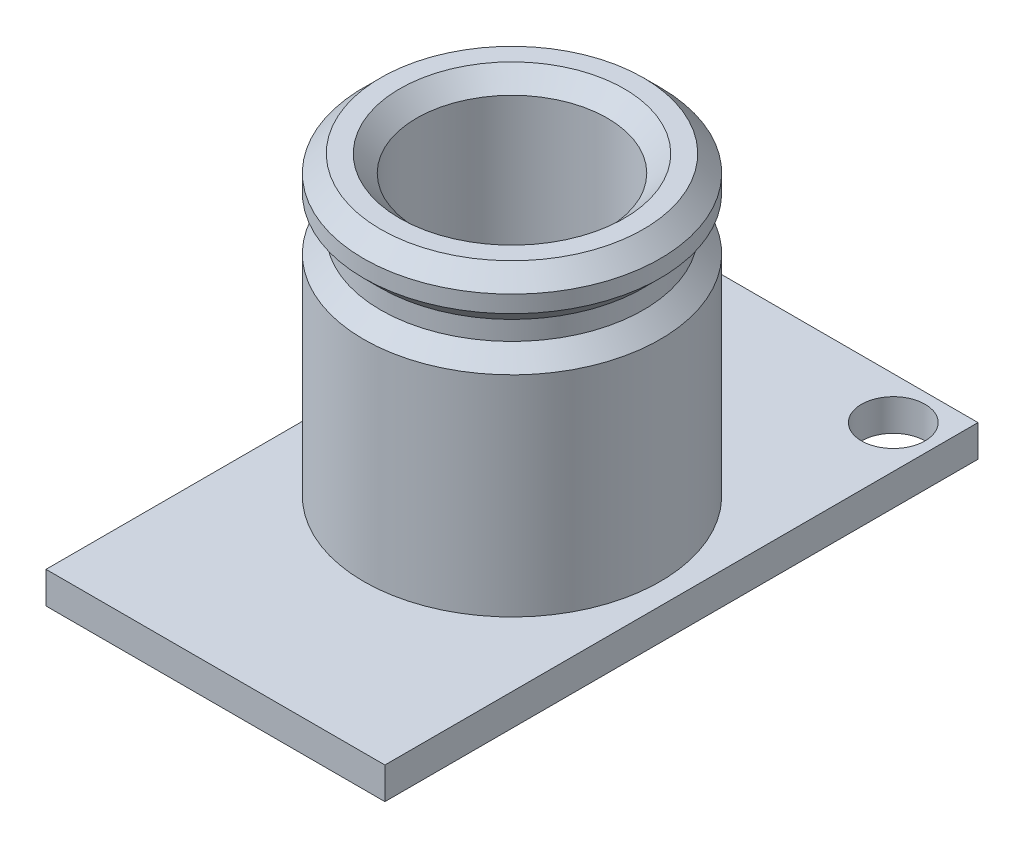
ISO-10303-21;
HEADER;
FILE_DESCRIPTION(('STEP AP214'),'2;1');
FILE_NAME('part.step','',(''),(''),'','','');
FILE_SCHEMA(('AUTOMOTIVE_DESIGN { 1 0 10303 214 1 1 1 1 }'));
ENDSEC;
DATA;
#1=APPLICATION_CONTEXT('core data for automotive mechanical design processes');
#2=APPLICATION_PROTOCOL_DEFINITION('international standard','automotive_design',2000,#1);
#3=PRODUCT_CONTEXT('',#1,'mechanical');
#4=PRODUCT('Part','Part','',(#3));
#5=PRODUCT_RELATED_PRODUCT_CATEGORY('part','',(#4));
#6=PRODUCT_DEFINITION_FORMATION('','',#4);
#7=PRODUCT_DEFINITION_CONTEXT('part definition',#1,'design');
#8=PRODUCT_DEFINITION('design','',#6,#7);
#9=PRODUCT_DEFINITION_SHAPE('','',#8);
#10=(LENGTH_UNIT() NAMED_UNIT(*) SI_UNIT(.MILLI.,.METRE.));
#11=(NAMED_UNIT(*) PLANE_ANGLE_UNIT() SI_UNIT($,.RADIAN.));
#12=(NAMED_UNIT(*) SI_UNIT($,.STERADIAN.) SOLID_ANGLE_UNIT());
#13=UNCERTAINTY_MEASURE_WITH_UNIT(LENGTH_MEASURE(1.E-05),#10,'distance_accuracy_value','');
#14=(GEOMETRIC_REPRESENTATION_CONTEXT(3) GLOBAL_UNCERTAINTY_ASSIGNED_CONTEXT((#13)) GLOBAL_UNIT_ASSIGNED_CONTEXT((#10,
#11,#12)) REPRESENTATION_CONTEXT('',''));
#15=CARTESIAN_POINT('',(0.,0.,0.));
#16=DIRECTION('',(0.,0.,1.));
#17=DIRECTION('',(1.,0.,0.));
#18=AXIS2_PLACEMENT_3D('',#15,#16,#17);
#19=CARTESIAN_POINT('',(0.,15.5,0.));
#20=DIRECTION('',(0.,-1.,0.));
#21=DIRECTION('',(0.,0.,-1.));
#22=AXIS2_PLACEMENT_3D('',#19,#20,#21);
#23=CYLINDRICAL_SURFACE('',#22,7.);
#24=CARTESIAN_POINT('',(0.,13.9,0.));
#25=DIRECTION('',(0.,-1.,0.));
#26=DIRECTION('',(0.,0.,-1.));
#27=AXIS2_PLACEMENT_3D('',#24,#25,#26);
#28=CIRCLE('',#27,7.00000000000005);
#29=CARTESIAN_POINT('',(0.,13.9,-7.));
#30=VERTEX_POINT('',#29);
#31=EDGE_CURVE('E75',#30,#30,#28,.T.);
#32=ORIENTED_EDGE('',*,*,#31,.F.);
#33=EDGE_LOOP('',(#32));
#34=FACE_BOUND('',#33,.T.);
#35=CARTESIAN_POINT('',(0.,14.7,0.));
#36=DIRECTION('',(0.,1.,0.));
#37=DIRECTION('',(0.,0.,1.));
#38=AXIS2_PLACEMENT_3D('',#35,#36,#37);
#39=CIRCLE('',#38,7.);
#40=CARTESIAN_POINT('',(0.,14.7,7.));
#41=VERTEX_POINT('',#40);
#42=EDGE_CURVE('E63',#41,#41,#39,.F.);
#43=ORIENTED_EDGE('',*,*,#42,.T.);
#44=EDGE_LOOP('',(#43));
#45=FACE_BOUND('',#44,.T.);
#46=ADVANCED_FACE('F51',(#34,#45),#23,.T.);
#47=CARTESIAN_POINT('',(0.,15.5,0.));
#48=DIRECTION('',(0.,1.,0.));
#49=DIRECTION('',(0.,0.,1.));
#50=AXIS2_PLACEMENT_3D('',#47,#48,#49);
#51=PLANE('',#50);
#52=CARTESIAN_POINT('',(0.,15.5,0.));
#53=DIRECTION('',(0.,1.,0.));
#54=DIRECTION('',(0.,0.,1.));
#55=AXIS2_PLACEMENT_3D('',#52,#53,#54);
#56=CIRCLE('',#55,5.3);
#57=CARTESIAN_POINT('',(0.,15.5,5.3));
#58=VERTEX_POINT('',#57);
#59=EDGE_CURVE('E11',#58,#58,#56,.F.);
#60=ORIENTED_EDGE('',*,*,#59,.T.);
#61=EDGE_LOOP('',(#60));
#62=FACE_BOUND('',#61,.T.);
#63=CARTESIAN_POINT('',(0.,15.5,0.));
#64=DIRECTION('',(0.,1.,0.));
#65=DIRECTION('',(0.,0.,1.));
#66=AXIS2_PLACEMENT_3D('',#63,#64,#65);
#67=CIRCLE('',#66,6.19999999999999);
#68=CARTESIAN_POINT('',(0.,15.5,6.19999999999999));
#69=VERTEX_POINT('',#68);
#70=EDGE_CURVE('E67',#69,#69,#67,.T.);
#71=ORIENTED_EDGE('',*,*,#70,.T.);
#72=EDGE_LOOP('',(#71));
#73=FACE_BOUND('',#72,.T.);
#74=ADVANCED_FACE('F109',(#62,#73),#51,.T.);
#75=CARTESIAN_POINT('',(0.,15.5,0.));
#76=DIRECTION('',(0.,-1.,0.));
#77=DIRECTION('',(0.,0.,-1.));
#78=AXIS2_PLACEMENT_3D('',#75,#76,#77);
#79=CONICAL_SURFACE('',#78,6.19999999999999,0.785398163397447);
#80=ORIENTED_EDGE('',*,*,#42,.F.);
#81=EDGE_LOOP('',(#80));
#82=FACE_BOUND('',#81,.T.);
#83=ORIENTED_EDGE('',*,*,#70,.F.);
#84=EDGE_LOOP('',(#83));
#85=FACE_BOUND('',#84,.T.);
#86=ADVANCED_FACE('F115',(#82,#85),#79,.T.);
#87=CARTESIAN_POINT('',(0.,13.9,0.));
#88=DIRECTION('',(0.,1.,0.));
#89=DIRECTION('',(0.,0.,1.));
#90=AXIS2_PLACEMENT_3D('',#87,#88,#89);
#91=CONICAL_SURFACE('',#90,7.00000000000005,0.785398163397366);
#92=CARTESIAN_POINT('',(0.,13.0999999999999,0.));
#93=DIRECTION('',(0.,-1.,0.));
#94=DIRECTION('',(0.,0.,-1.));
#95=AXIS2_PLACEMENT_3D('',#92,#93,#94);
#96=CIRCLE('',#95,6.20000000000004);
#97=CARTESIAN_POINT('',(0.,13.0999999999999,-6.2));
#98=VERTEX_POINT('',#97);
#99=EDGE_CURVE('E78',#98,#98,#96,.T.);
#100=ORIENTED_EDGE('',*,*,#99,.F.);
#101=EDGE_LOOP('',(#100));
#102=FACE_BOUND('',#101,.T.);
#103=ORIENTED_EDGE('',*,*,#31,.T.);
#104=EDGE_LOOP('',(#103));
#105=FACE_BOUND('',#104,.T.);
#106=ADVANCED_FACE('F123',(#102,#105),#91,.T.);
#107=CARTESIAN_POINT('',(0.,-1000.,-3.43024899888577E-12));
#108=DIRECTION('',(0.,-1.,0.));
#109=DIRECTION('',(0.,0.,-1.));
#110=AXIS2_PLACEMENT_3D('',#107,#108,#109);
#111=CYLINDRICAL_SURFACE('',#110,6.20000000000004);
#112=CARTESIAN_POINT('',(0.,12.2,0.));
#113=DIRECTION('',(0.,-1.,0.));
#114=DIRECTION('',(0.,0.,-1.));
#115=AXIS2_PLACEMENT_3D('',#112,#113,#114);
#116=CIRCLE('',#115,6.20000000000004);
#117=CARTESIAN_POINT('',(0.,12.2,-6.2));
#118=VERTEX_POINT('',#117);
#119=EDGE_CURVE('E81',#118,#118,#116,.T.);
#120=ORIENTED_EDGE('',*,*,#119,.F.);
#121=EDGE_LOOP('',(#120));
#122=FACE_BOUND('',#121,.T.);
#123=ORIENTED_EDGE('',*,*,#99,.T.);
#124=EDGE_LOOP('',(#123));
#125=FACE_BOUND('',#124,.T.);
#126=ADVANCED_FACE('F128',(#122,#125),#111,.T.);
#127=CARTESIAN_POINT('',(0.,12.2,0.));
#128=DIRECTION('',(0.,-1.,0.));
#129=DIRECTION('',(0.,0.,-1.));
#130=AXIS2_PLACEMENT_3D('',#127,#128,#129);
#131=CONICAL_SURFACE('',#130,6.20000000000004,0.785398163397503);
#132=CARTESIAN_POINT('',(0.,11.4000000000001,0.));
#133=DIRECTION('',(0.,-1.,0.));
#134=DIRECTION('',(0.,0.,-1.));
#135=AXIS2_PLACEMENT_3D('',#132,#133,#134);
#136=CIRCLE('',#135,7.00000000000004);
#137=CARTESIAN_POINT('',(0.,11.4000000000001,-7.));
#138=VERTEX_POINT('',#137);
#139=EDGE_CURVE('E84',#138,#138,#136,.T.);
#140=ORIENTED_EDGE('',*,*,#139,.F.);
#141=EDGE_LOOP('',(#140));
#142=FACE_BOUND('',#141,.T.);
#143=ORIENTED_EDGE('',*,*,#119,.T.);
#144=EDGE_LOOP('',(#143));
#145=FACE_BOUND('',#144,.T.);
#146=ADVANCED_FACE('F138',(#142,#145),#131,.T.);
#147=CARTESIAN_POINT('',(0.,1.5,0.));
#148=DIRECTION('',(0.,1.,0.));
#149=DIRECTION('',(0.,0.,1.));
#150=AXIS2_PLACEMENT_3D('',#147,#148,#149);
#151=PLANE('',#150);
#152=CARTESIAN_POINT('',(0.,1.5,0.));
#153=DIRECTION('',(0.,1.,0.));
#154=DIRECTION('',(0.,0.,1.));
#155=AXIS2_PLACEMENT_3D('',#152,#153,#154);
#156=CIRCLE('',#155,7.);
#157=CARTESIAN_POINT('',(0.,1.5,7.));
#158=VERTEX_POINT('',#157);
#159=EDGE_CURVE('E72',#158,#158,#156,.T.);
#160=ORIENTED_EDGE('',*,*,#159,.F.);
#161=EDGE_LOOP('',(#160));
#162=FACE_BOUND('',#161,.T.);
#163=ADVANCED_FACE('F104',(#162),#151,.F.);
#164=ORIENTED_EDGE('',*,*,#139,.T.);
#165=EDGE_LOOP('',(#164));
#166=FACE_BOUND('',#165,.T.);
#167=ORIENTED_EDGE('',*,*,#159,.T.);
#168=EDGE_LOOP('',(#167));
#169=FACE_BOUND('',#168,.T.);
#170=ADVANCED_FACE('F95',(#166,#169),#23,.T.);
#171=CARTESIAN_POINT('',(0.,7.5,0.));
#172=DIRECTION('',(0.,1.,0.));
#173=DIRECTION('',(0.,0.,1.));
#174=AXIS2_PLACEMENT_3D('',#171,#172,#173);
#175=CYLINDRICAL_SURFACE('',#174,4.5);
#176=CARTESIAN_POINT('',(0.,14.7,0.));
#177=DIRECTION('',(0.,1.,0.));
#178=DIRECTION('',(0.,0.,1.));
#179=AXIS2_PLACEMENT_3D('',#176,#177,#178);
#180=CIRCLE('',#179,4.5);
#181=CARTESIAN_POINT('',(0.,14.7,4.5));
#182=VERTEX_POINT('',#181);
#183=EDGE_CURVE('E59',#182,#182,#180,.T.);
#184=ORIENTED_EDGE('',*,*,#183,.T.);
#185=EDGE_LOOP('',(#184));
#186=FACE_BOUND('',#185,.T.);
#187=CARTESIAN_POINT('',(0.,7.5,0.));
#188=DIRECTION('',(0.,1.,0.));
#189=DIRECTION('',(0.,0.,1.));
#190=AXIS2_PLACEMENT_3D('',#187,#188,#189);
#191=CIRCLE('',#190,4.5);
#192=CARTESIAN_POINT('',(0.,7.5,4.5));
#193=VERTEX_POINT('',#192);
#194=EDGE_CURVE('E87',#193,#193,#191,.T.);
#195=ORIENTED_EDGE('',*,*,#194,.F.);
#196=EDGE_LOOP('',(#195));
#197=FACE_BOUND('',#196,.T.);
#198=ADVANCED_FACE('F93',(#186,#197),#175,.F.);
#199=CARTESIAN_POINT('',(0.,7.5,0.));
#200=DIRECTION('',(0.,1.,0.));
#201=DIRECTION('',(0.,0.,1.));
#202=AXIS2_PLACEMENT_3D('',#199,#200,#201);
#203=PLANE('',#202);
#204=ORIENTED_EDGE('',*,*,#194,.T.);
#205=EDGE_LOOP('',(#204));
#206=FACE_BOUND('',#205,.T.);
#207=ADVANCED_FACE('F91',(#206),#203,.T.);
#208=CARTESIAN_POINT('',(0.,14.7,0.));
#209=DIRECTION('',(0.,1.,0.));
#210=DIRECTION('',(0.,0.,1.));
#211=AXIS2_PLACEMENT_3D('',#208,#209,#210);
#212=CONICAL_SURFACE('',#211,4.5,0.785398163397449);
#213=ORIENTED_EDGE('',*,*,#59,.F.);
#214=EDGE_LOOP('',(#213));
#215=FACE_BOUND('',#214,.T.);
#216=ORIENTED_EDGE('',*,*,#183,.F.);
#217=EDGE_LOOP('',(#216));
#218=FACE_BOUND('',#217,.T.);
#219=ADVANCED_FACE('F54',(#215,#218),#212,.F.);
#220=CLOSED_SHELL('',(#46,#74,#86,#106,#126,#146,#163,#170,#198,#207,#219));
#221=MANIFOLD_SOLID_BREP('B2',#220);
#222=CARTESIAN_POINT('',(8.,1.5,-14.));
#223=DIRECTION('',(-1.,0.,0.));
#224=DIRECTION('',(0.,0.,1.));
#225=AXIS2_PLACEMENT_3D('',#222,#223,#224);
#226=PLANE('',#225);
#227=DIRECTION('',(0.,0.,-1.));
#228=VECTOR('',#227,1.);
#229=CARTESIAN_POINT('',(8.,0.,-14.));
#230=LINE('',#229,#228);
#231=CARTESIAN_POINT('',(8.,0.,14.));
#232=VERTEX_POINT('',#231);
#233=CARTESIAN_POINT('',(8.,0.,-14.));
#234=VERTEX_POINT('',#233);
#235=EDGE_CURVE('E280',#232,#234,#230,.T.);
#236=ORIENTED_EDGE('',*,*,#235,.T.);
#237=DIRECTION('',(0.,-1.,0.));
#238=VECTOR('',#237,1.);
#239=CARTESIAN_POINT('',(8.,1.5,-14.));
#240=LINE('',#239,#238);
#241=CARTESIAN_POINT('',(8.,1.5,-14.));
#242=VERTEX_POINT('',#241);
#243=EDGE_CURVE('E49',#242,#234,#240,.T.);
#244=ORIENTED_EDGE('',*,*,#243,.F.);
#245=DIRECTION('',(0.,0.,-1.));
#246=VECTOR('',#245,1.);
#247=CARTESIAN_POINT('',(8.,1.5,-14.));
#248=LINE('',#247,#246);
#249=CARTESIAN_POINT('',(8.,1.5,14.));
#250=VERTEX_POINT('',#249);
#251=EDGE_CURVE('E268',#250,#242,#248,.T.);
#252=ORIENTED_EDGE('',*,*,#251,.F.);
#253=DIRECTION('',(0.,-1.,0.));
#254=VECTOR('',#253,1.);
#255=CARTESIAN_POINT('',(8.,1.5,14.));
#256=LINE('',#255,#254);
#257=EDGE_CURVE('E276',#250,#232,#256,.T.);
#258=ORIENTED_EDGE('',*,*,#257,.T.);
#259=EDGE_LOOP('',(#236,#244,#252,#258));
#260=FACE_BOUND('',#259,.T.);
#261=ADVANCED_FACE('F217',(#260),#226,.F.);
#262=CARTESIAN_POINT('',(-8.,1.5,-14.));
#263=DIRECTION('',(0.,0.,1.));
#264=DIRECTION('',(1.,0.,0.));
#265=AXIS2_PLACEMENT_3D('',#262,#263,#264);
#266=PLANE('',#265);
#267=DIRECTION('',(-1.,0.,0.));
#268=VECTOR('',#267,1.);
#269=CARTESIAN_POINT('',(-8.,0.,-14.));
#270=LINE('',#269,#268);
#271=CARTESIAN_POINT('',(-8.,0.,-14.));
#272=VERTEX_POINT('',#271);
#273=EDGE_CURVE('E272',#234,#272,#270,.T.);
#274=ORIENTED_EDGE('',*,*,#273,.T.);
#275=DIRECTION('',(0.,-1.,0.));
#276=VECTOR('',#275,1.);
#277=CARTESIAN_POINT('',(-8.,1.5,-14.));
#278=LINE('',#277,#276);
#279=CARTESIAN_POINT('',(-8.,1.5,-14.));
#280=VERTEX_POINT('',#279);
#281=EDGE_CURVE('E225',#280,#272,#278,.T.);
#282=ORIENTED_EDGE('',*,*,#281,.F.);
#283=DIRECTION('',(-1.,0.,0.));
#284=VECTOR('',#283,1.);
#285=CARTESIAN_POINT('',(-8.,1.5,-14.));
#286=LINE('',#285,#284);
#287=EDGE_CURVE('E263',#242,#280,#286,.T.);
#288=ORIENTED_EDGE('',*,*,#287,.F.);
#289=ORIENTED_EDGE('',*,*,#243,.T.);
#290=EDGE_LOOP('',(#274,#282,#288,#289));
#291=FACE_BOUND('',#290,.T.);
#292=ADVANCED_FACE('F271',(#291),#266,.F.);
#293=CARTESIAN_POINT('',(-8.,1.5,-14.));
#294=DIRECTION('',(1.,0.,0.));
#295=DIRECTION('',(0.,0.,-1.));
#296=AXIS2_PLACEMENT_3D('',#293,#294,#295);
#297=PLANE('',#296);
#298=DIRECTION('',(0.,0.,1.));
#299=VECTOR('',#298,1.);
#300=CARTESIAN_POINT('',(-8.,0.,-14.));
#301=LINE('',#300,#299);
#302=CARTESIAN_POINT('',(-8.,0.,14.));
#303=VERTEX_POINT('',#302);
#304=EDGE_CURVE('E250',#272,#303,#301,.T.);
#305=ORIENTED_EDGE('',*,*,#304,.T.);
#306=DIRECTION('',(0.,-1.,0.));
#307=VECTOR('',#306,1.);
#308=CARTESIAN_POINT('',(-8.,1.5,14.));
#309=LINE('',#308,#307);
#310=CARTESIAN_POINT('',(-8.,1.5,14.));
#311=VERTEX_POINT('',#310);
#312=EDGE_CURVE('E273',#311,#303,#309,.T.);
#313=ORIENTED_EDGE('',*,*,#312,.F.);
#314=DIRECTION('',(0.,0.,1.));
#315=VECTOR('',#314,1.);
#316=CARTESIAN_POINT('',(-8.,1.5,-14.));
#317=LINE('',#316,#315);
#318=EDGE_CURVE('E266',#280,#311,#317,.T.);
#319=ORIENTED_EDGE('',*,*,#318,.F.);
#320=ORIENTED_EDGE('',*,*,#281,.T.);
#321=EDGE_LOOP('',(#305,#313,#319,#320));
#322=FACE_BOUND('',#321,.T.);
#323=ADVANCED_FACE('F274',(#322),#297,.F.);
#324=CARTESIAN_POINT('',(-8.,1.5,14.));
#325=DIRECTION('',(0.,0.,-1.));
#326=DIRECTION('',(-1.,0.,0.));
#327=AXIS2_PLACEMENT_3D('',#324,#325,#326);
#328=PLANE('',#327);
#329=DIRECTION('',(1.,0.,0.));
#330=VECTOR('',#329,1.);
#331=CARTESIAN_POINT('',(-8.,0.,14.));
#332=LINE('',#331,#330);
#333=EDGE_CURVE('E256',#303,#232,#332,.T.);
#334=ORIENTED_EDGE('',*,*,#333,.T.);
#335=ORIENTED_EDGE('',*,*,#257,.F.);
#336=DIRECTION('',(1.,0.,0.));
#337=VECTOR('',#336,1.);
#338=CARTESIAN_POINT('',(-8.,1.5,14.));
#339=LINE('',#338,#337);
#340=EDGE_CURVE('E233',#311,#250,#339,.T.);
#341=ORIENTED_EDGE('',*,*,#340,.F.);
#342=ORIENTED_EDGE('',*,*,#312,.T.);
#343=EDGE_LOOP('',(#334,#335,#341,#342));
#344=FACE_BOUND('',#343,.T.);
#345=ADVANCED_FACE('F288',(#344),#328,.F.);
#346=CARTESIAN_POINT('',(0.,1.5,0.));
#347=DIRECTION('',(0.,1.,0.));
#348=DIRECTION('',(0.,0.,1.));
#349=AXIS2_PLACEMENT_3D('',#346,#347,#348);
#350=PLANE('',#349);
#351=CARTESIAN_POINT('',(6.,1.5,-12.));
#352=DIRECTION('',(0.,-1.,0.));
#353=DIRECTION('',(0.,0.,1.));
#354=AXIS2_PLACEMENT_3D('',#351,#352,#353);
#355=CIRCLE('',#354,1.5);
#356=CARTESIAN_POINT('',(6.,1.5,-10.5));
#357=VERTEX_POINT('',#356);
#358=EDGE_CURVE('E300',#357,#357,#355,.T.);
#359=ORIENTED_EDGE('',*,*,#358,.T.);
#360=EDGE_LOOP('',(#359));
#361=FACE_BOUND('',#360,.T.);
#362=CARTESIAN_POINT('',(-6.,1.5,-12.));
#363=DIRECTION('',(0.,1.,0.));
#364=DIRECTION('',(0.,0.,1.));
#365=AXIS2_PLACEMENT_3D('',#362,#363,#364);
#366=CIRCLE('',#365,1.5);
#367=CARTESIAN_POINT('',(-6.,1.5,-10.5));
#368=VERTEX_POINT('',#367);
#369=EDGE_CURVE('E294',#368,#368,#366,.T.);
#370=ORIENTED_EDGE('',*,*,#369,.F.);
#371=EDGE_LOOP('',(#370));
#372=FACE_BOUND('',#371,.T.);
#373=ORIENTED_EDGE('',*,*,#251,.T.);
#374=ORIENTED_EDGE('',*,*,#287,.T.);
#375=ORIENTED_EDGE('',*,*,#318,.T.);
#376=ORIENTED_EDGE('',*,*,#340,.T.);
#377=EDGE_LOOP('',(#373,#374,#375,#376));
#378=FACE_BOUND('',#377,.T.);
#379=ADVANCED_FACE('F264',(#361,#372,#378),#350,.T.);
#380=CARTESIAN_POINT('',(0.,0.,0.));
#381=DIRECTION('',(0.,1.,0.));
#382=DIRECTION('',(0.,0.,1.));
#383=AXIS2_PLACEMENT_3D('',#380,#381,#382);
#384=PLANE('',#383);
#385=CARTESIAN_POINT('',(6.,0.,-12.));
#386=DIRECTION('',(0.,-1.,0.));
#387=DIRECTION('',(0.,0.,1.));
#388=AXIS2_PLACEMENT_3D('',#385,#386,#387);
#389=CIRCLE('',#388,1.5);
#390=CARTESIAN_POINT('',(6.,0.,-10.5));
#391=VERTEX_POINT('',#390);
#392=EDGE_CURVE('E297',#391,#391,#389,.T.);
#393=ORIENTED_EDGE('',*,*,#392,.F.);
#394=EDGE_LOOP('',(#393));
#395=FACE_BOUND('',#394,.T.);
#396=CARTESIAN_POINT('',(-6.,0.,-12.));
#397=DIRECTION('',(0.,1.,0.));
#398=DIRECTION('',(0.,0.,1.));
#399=AXIS2_PLACEMENT_3D('',#396,#397,#398);
#400=CIRCLE('',#399,1.5);
#401=CARTESIAN_POINT('',(-6.,0.,-10.5));
#402=VERTEX_POINT('',#401);
#403=EDGE_CURVE('E283',#402,#402,#400,.T.);
#404=ORIENTED_EDGE('',*,*,#403,.T.);
#405=EDGE_LOOP('',(#404));
#406=FACE_BOUND('',#405,.T.);
#407=ORIENTED_EDGE('',*,*,#235,.F.);
#408=ORIENTED_EDGE('',*,*,#333,.F.);
#409=ORIENTED_EDGE('',*,*,#304,.F.);
#410=ORIENTED_EDGE('',*,*,#273,.F.);
#411=EDGE_LOOP('',(#407,#408,#409,#410));
#412=FACE_BOUND('',#411,.T.);
#413=ADVANCED_FACE('F291',(#395,#406,#412),#384,.F.);
#414=CARTESIAN_POINT('',(-6.,0.,-12.));
#415=DIRECTION('',(0.,1.,0.));
#416=DIRECTION('',(0.,0.,1.));
#417=AXIS2_PLACEMENT_3D('',#414,#415,#416);
#418=CYLINDRICAL_SURFACE('',#417,1.5);
#419=ORIENTED_EDGE('',*,*,#403,.F.);
#420=EDGE_LOOP('',(#419));
#421=FACE_BOUND('',#420,.T.);
#422=ORIENTED_EDGE('',*,*,#369,.T.);
#423=EDGE_LOOP('',(#422));
#424=FACE_BOUND('',#423,.T.);
#425=ADVANCED_FACE('F311',(#421,#424),#418,.F.);
#426=CARTESIAN_POINT('',(6.,0.,-12.));
#427=DIRECTION('',(0.,1.,0.));
#428=DIRECTION('',(0.,0.,1.));
#429=AXIS2_PLACEMENT_3D('',#426,#427,#428);
#430=CYLINDRICAL_SURFACE('',#429,1.5);
#431=ORIENTED_EDGE('',*,*,#392,.T.);
#432=EDGE_LOOP('',(#431));
#433=FACE_BOUND('',#432,.T.);
#434=ORIENTED_EDGE('',*,*,#358,.F.);
#435=EDGE_LOOP('',(#434));
#436=FACE_BOUND('',#435,.T.);
#437=ADVANCED_FACE('F306',(#433,#436),#430,.F.);
#438=CLOSED_SHELL('',(#261,#292,#323,#345,#379,#413,#425,#437));
#439=MANIFOLD_SOLID_BREP('B6',#438);
#440=ADVANCED_BREP_SHAPE_REPRESENTATION('',(#18,#221,#439),#14);
#441=SHAPE_DEFINITION_REPRESENTATION(#9,#440);
ENDSEC;
END-ISO-10303-21;
